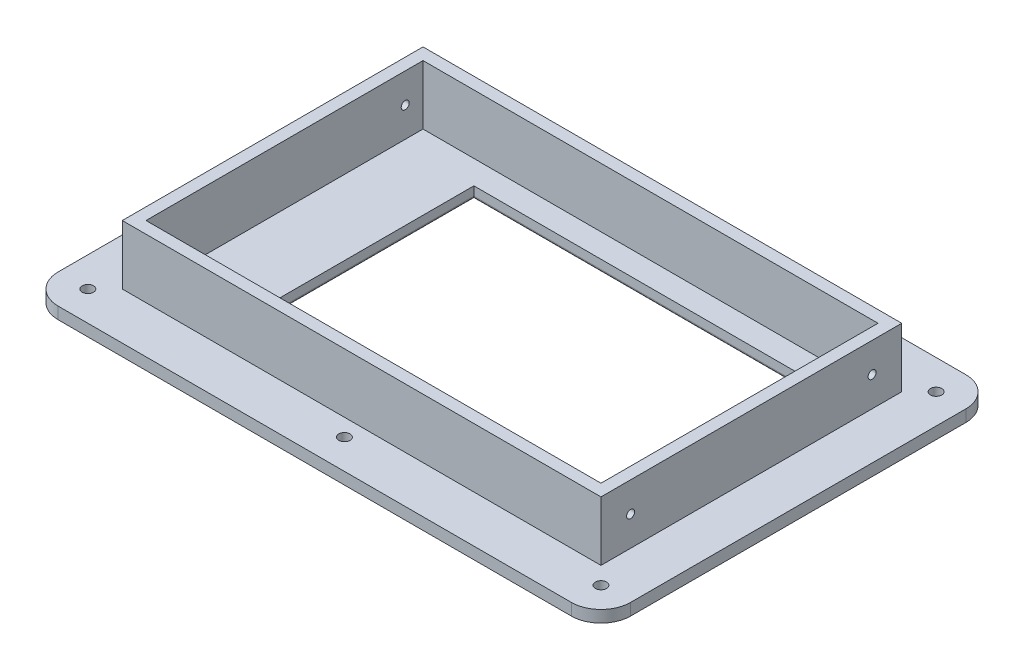
ISO-10303-21;
HEADER;
FILE_DESCRIPTION(('STEP AP214'),'2;1');
FILE_NAME('part.step','',(''),(''),'','','');
FILE_SCHEMA(('AUTOMOTIVE_DESIGN { 1 0 10303 214 1 1 1 1 }'));
ENDSEC;
DATA;
#1=APPLICATION_CONTEXT('core data for automotive mechanical design processes');
#2=APPLICATION_PROTOCOL_DEFINITION('international standard','automotive_design',2000,#1);
#3=PRODUCT_CONTEXT('',#1,'mechanical');
#4=PRODUCT('Part','Part','',(#3));
#5=PRODUCT_RELATED_PRODUCT_CATEGORY('part','',(#4));
#6=PRODUCT_DEFINITION_FORMATION('','',#4);
#7=PRODUCT_DEFINITION_CONTEXT('part definition',#1,'design');
#8=PRODUCT_DEFINITION('design','',#6,#7);
#9=PRODUCT_DEFINITION_SHAPE('','',#8);
#10=(LENGTH_UNIT() NAMED_UNIT(*) SI_UNIT(.MILLI.,.METRE.));
#11=(NAMED_UNIT(*) PLANE_ANGLE_UNIT() SI_UNIT($,.RADIAN.));
#12=(NAMED_UNIT(*) SI_UNIT($,.STERADIAN.) SOLID_ANGLE_UNIT());
#13=UNCERTAINTY_MEASURE_WITH_UNIT(LENGTH_MEASURE(1.E-05),#10,'distance_accuracy_value','');
#14=(GEOMETRIC_REPRESENTATION_CONTEXT(3) GLOBAL_UNCERTAINTY_ASSIGNED_CONTEXT((#13)) GLOBAL_UNIT_ASSIGNED_CONTEXT((#10,
#11,#12)) REPRESENTATION_CONTEXT('',''));
#15=CARTESIAN_POINT('',(0.,0.,0.));
#16=DIRECTION('',(0.,0.,1.));
#17=DIRECTION('',(1.,0.,0.));
#18=AXIS2_PLACEMENT_3D('',#15,#16,#17);
#19=CARTESIAN_POINT('',(0.,4.,0.));
#20=DIRECTION('',(0.,-1.,0.));
#21=DIRECTION('',(0.,0.,-1.));
#22=AXIS2_PLACEMENT_3D('',#19,#20,#21);
#23=PLANE('',#22);
#24=CARTESIAN_POINT('',(-86.5,4.,56.5));
#25=DIRECTION('',(0.,-1.,0.));
#26=DIRECTION('',(0.,0.,-1.));
#27=AXIS2_PLACEMENT_3D('',#24,#25,#26);
#28=CIRCLE('',#27,1.89864999999999);
#29=CARTESIAN_POINT('',(-86.5,4.,54.60135));
#30=VERTEX_POINT('',#29);
#31=EDGE_CURVE('E527',#30,#30,#28,.T.);
#32=ORIENTED_EDGE('',*,*,#31,.T.);
#33=EDGE_LOOP('',(#32));
#34=FACE_BOUND('',#33,.T.);
#35=CARTESIAN_POINT('',(-86.5,4.,-56.5));
#36=DIRECTION('',(0.,-1.,0.));
#37=DIRECTION('',(0.,0.,-1.));
#38=AXIS2_PLACEMENT_3D('',#35,#36,#37);
#39=CIRCLE('',#38,1.89864999999999);
#40=CARTESIAN_POINT('',(-86.5,4.,-58.39865));
#41=VERTEX_POINT('',#40);
#42=EDGE_CURVE('E538',#41,#41,#39,.T.);
#43=ORIENTED_EDGE('',*,*,#42,.T.);
#44=EDGE_LOOP('',(#43));
#45=FACE_BOUND('',#44,.T.);
#46=CARTESIAN_POINT('',(86.5,4.,-56.5));
#47=DIRECTION('',(0.,-1.,0.));
#48=DIRECTION('',(0.,0.,-1.));
#49=AXIS2_PLACEMENT_3D('',#46,#47,#48);
#50=CIRCLE('',#49,1.89864999999999);
#51=CARTESIAN_POINT('',(86.5,4.,-58.39865));
#52=VERTEX_POINT('',#51);
#53=EDGE_CURVE('E544',#52,#52,#50,.T.);
#54=ORIENTED_EDGE('',*,*,#53,.T.);
#55=EDGE_LOOP('',(#54));
#56=FACE_BOUND('',#55,.T.);
#57=CARTESIAN_POINT('',(86.5,4.,56.5));
#58=DIRECTION('',(0.,-1.,0.));
#59=DIRECTION('',(0.,0.,-1.));
#60=AXIS2_PLACEMENT_3D('',#57,#58,#59);
#61=CIRCLE('',#60,1.89864999999999);
#62=CARTESIAN_POINT('',(86.5,4.,54.60135));
#63=VERTEX_POINT('',#62);
#64=EDGE_CURVE('E550',#63,#63,#61,.T.);
#65=ORIENTED_EDGE('',*,*,#64,.T.);
#66=EDGE_LOOP('',(#65));
#67=FACE_BOUND('',#66,.T.);
#68=CARTESIAN_POINT('',(0.,4.,56.5));
#69=DIRECTION('',(0.,-1.,0.));
#70=DIRECTION('',(0.,0.,-1.));
#71=AXIS2_PLACEMENT_3D('',#68,#69,#70);
#72=CIRCLE('',#71,1.89864999999999);
#73=CARTESIAN_POINT('',(0.,4.,54.60135));
#74=VERTEX_POINT('',#73);
#75=EDGE_CURVE('E556',#74,#74,#72,.T.);
#76=ORIENTED_EDGE('',*,*,#75,.T.);
#77=EDGE_LOOP('',(#76));
#78=FACE_BOUND('',#77,.T.);
#79=CARTESIAN_POINT('',(0.,4.,-56.5));
#80=DIRECTION('',(0.,-1.,0.));
#81=DIRECTION('',(0.,0.,-1.));
#82=AXIS2_PLACEMENT_3D('',#79,#80,#81);
#83=CIRCLE('',#82,1.89864999999999);
#84=CARTESIAN_POINT('',(0.,4.,-58.39865));
#85=VERTEX_POINT('',#84);
#86=EDGE_CURVE('E260',#85,#85,#83,.T.);
#87=ORIENTED_EDGE('',*,*,#86,.T.);
#88=EDGE_LOOP('',(#87));
#89=FACE_BOUND('',#88,.T.);
#90=DIRECTION('',(1.,0.,0.));
#91=VECTOR('',#90,1.);
#92=CARTESIAN_POINT('',(-96.5,4.,66.5));
#93=LINE('',#92,#91);
#94=CARTESIAN_POINT('',(-86.5,4.,66.5));
#95=VERTEX_POINT('',#94);
#96=CARTESIAN_POINT('',(86.5,4.,66.5));
#97=VERTEX_POINT('',#96);
#98=EDGE_CURVE('E220',#95,#97,#93,.T.);
#99=ORIENTED_EDGE('',*,*,#98,.T.);
#100=CARTESIAN_POINT('',(86.5,4.,56.5));
#101=DIRECTION('',(0.,-1.,0.));
#102=DIRECTION('',(0.,0.,-1.));
#103=AXIS2_PLACEMENT_3D('',#100,#101,#102);
#104=CIRCLE('',#103,10.);
#105=CARTESIAN_POINT('',(96.5,4.,56.5));
#106=VERTEX_POINT('',#105);
#107=EDGE_CURVE('E289',#97,#106,#104,.F.);
#108=ORIENTED_EDGE('',*,*,#107,.T.);
#109=DIRECTION('',(0.,0.,-1.));
#110=VECTOR('',#109,1.);
#111=CARTESIAN_POINT('',(96.5,4.,66.5));
#112=LINE('',#111,#110);
#113=CARTESIAN_POINT('',(96.5,4.,-56.5));
#114=VERTEX_POINT('',#113);
#115=EDGE_CURVE('E322',#106,#114,#112,.T.);
#116=ORIENTED_EDGE('',*,*,#115,.T.);
#117=CARTESIAN_POINT('',(86.5,4.,-56.5));
#118=DIRECTION('',(0.,-1.,0.));
#119=DIRECTION('',(0.,0.,-1.));
#120=AXIS2_PLACEMENT_3D('',#117,#118,#119);
#121=CIRCLE('',#120,10.);
#122=CARTESIAN_POINT('',(86.5,4.,-66.5));
#123=VERTEX_POINT('',#122);
#124=EDGE_CURVE('E284',#114,#123,#121,.F.);
#125=ORIENTED_EDGE('',*,*,#124,.T.);
#126=DIRECTION('',(-1.,0.,0.));
#127=VECTOR('',#126,1.);
#128=CARTESIAN_POINT('',(-96.5,4.,-66.5));
#129=LINE('',#128,#127);
#130=CARTESIAN_POINT('',(-86.5,4.,-66.5));
#131=VERTEX_POINT('',#130);
#132=EDGE_CURVE('E304',#123,#131,#129,.T.);
#133=ORIENTED_EDGE('',*,*,#132,.T.);
#134=CARTESIAN_POINT('',(-86.5,4.,-56.5));
#135=DIRECTION('',(0.,-1.,0.));
#136=DIRECTION('',(0.,0.,-1.));
#137=AXIS2_PLACEMENT_3D('',#134,#135,#136);
#138=CIRCLE('',#137,10.);
#139=CARTESIAN_POINT('',(-96.5,4.,-56.5));
#140=VERTEX_POINT('',#139);
#141=EDGE_CURVE('E80',#131,#140,#138,.F.);
#142=ORIENTED_EDGE('',*,*,#141,.T.);
#143=DIRECTION('',(0.,0.,1.));
#144=VECTOR('',#143,1.);
#145=CARTESIAN_POINT('',(-96.5,4.,66.5));
#146=LINE('',#145,#144);
#147=CARTESIAN_POINT('',(-96.5,4.,56.5));
#148=VERTEX_POINT('',#147);
#149=EDGE_CURVE('E403',#140,#148,#146,.T.);
#150=ORIENTED_EDGE('',*,*,#149,.T.);
#151=CARTESIAN_POINT('',(-86.5,4.,56.5));
#152=DIRECTION('',(0.,-1.,0.));
#153=DIRECTION('',(0.,0.,-1.));
#154=AXIS2_PLACEMENT_3D('',#151,#152,#153);
#155=CIRCLE('',#154,10.);
#156=EDGE_CURVE('E287',#148,#95,#155,.F.);
#157=ORIENTED_EDGE('',*,*,#156,.T.);
#158=EDGE_LOOP('',(#99,#108,#116,#125,#133,#142,#150,#157));
#159=FACE_BOUND('',#158,.T.);
#160=DIRECTION('',(0.,0.,-1.));
#161=VECTOR('',#160,1.);
#162=CARTESIAN_POINT('',(80.7,4.,0.));
#163=LINE('',#162,#161);
#164=CARTESIAN_POINT('',(80.7,4.,50.7));
#165=VERTEX_POINT('',#164);
#166=CARTESIAN_POINT('',(80.7,4.,-50.7));
#167=VERTEX_POINT('',#166);
#168=EDGE_CURVE('E368',#165,#167,#163,.T.);
#169=ORIENTED_EDGE('',*,*,#168,.F.);
#170=DIRECTION('',(1.,0.,0.));
#171=VECTOR('',#170,1.);
#172=CARTESIAN_POINT('',(0.,4.,50.7));
#173=LINE('',#172,#171);
#174=CARTESIAN_POINT('',(-80.7,4.,50.7));
#175=VERTEX_POINT('',#174);
#176=EDGE_CURVE('E373',#175,#165,#173,.T.);
#177=ORIENTED_EDGE('',*,*,#176,.F.);
#178=DIRECTION('',(0.,0.,1.));
#179=VECTOR('',#178,1.);
#180=CARTESIAN_POINT('',(-80.7,4.,0.));
#181=LINE('',#180,#179);
#182=CARTESIAN_POINT('',(-80.7,4.,-50.7));
#183=VERTEX_POINT('',#182);
#184=EDGE_CURVE('E385',#183,#175,#181,.T.);
#185=ORIENTED_EDGE('',*,*,#184,.F.);
#186=DIRECTION('',(-1.,0.,0.));
#187=VECTOR('',#186,1.);
#188=CARTESIAN_POINT('',(0.,4.,-50.7));
#189=LINE('',#188,#187);
#190=EDGE_CURVE('E382',#167,#183,#189,.T.);
#191=ORIENTED_EDGE('',*,*,#190,.F.);
#192=EDGE_LOOP('',(#169,#177,#185,#191));
#193=FACE_BOUND('',#192,.T.);
#194=ADVANCED_FACE('F57',(#34,#45,#56,#67,#78,#89,#159,#193),#23,.F.);
#195=CARTESIAN_POINT('',(96.5,4.,66.5));
#196=DIRECTION('',(-1.,0.,0.));
#197=DIRECTION('',(0.,0.,1.));
#198=AXIS2_PLACEMENT_3D('',#195,#196,#197);
#199=PLANE('',#198);
#200=ORIENTED_EDGE('',*,*,#115,.F.);
#201=DIRECTION('',(0.,-1.,0.));
#202=VECTOR('',#201,1.);
#203=CARTESIAN_POINT('',(96.5,4.,56.5));
#204=LINE('',#203,#202);
#205=CARTESIAN_POINT('',(96.5,0.,56.5));
#206=VERTEX_POINT('',#205);
#207=EDGE_CURVE('E268',#106,#206,#204,.T.);
#208=ORIENTED_EDGE('',*,*,#207,.T.);
#209=DIRECTION('',(0.,0.,-1.));
#210=VECTOR('',#209,1.);
#211=CARTESIAN_POINT('',(96.5,0.,66.5));
#212=LINE('',#211,#210);
#213=CARTESIAN_POINT('',(96.5,0.,-56.5));
#214=VERTEX_POINT('',#213);
#215=EDGE_CURVE('E313',#206,#214,#212,.T.);
#216=ORIENTED_EDGE('',*,*,#215,.T.);
#217=DIRECTION('',(0.,-1.,0.));
#218=VECTOR('',#217,1.);
#219=CARTESIAN_POINT('',(96.5,4.,-56.5));
#220=LINE('',#219,#218);
#221=EDGE_CURVE('E256',#214,#114,#220,.F.);
#222=ORIENTED_EDGE('',*,*,#221,.T.);
#223=EDGE_LOOP('',(#200,#208,#216,#222));
#224=FACE_BOUND('',#223,.T.);
#225=ADVANCED_FACE('F417',(#224),#199,.F.);
#226=CARTESIAN_POINT('',(-96.5,4.,-66.5));
#227=DIRECTION('',(0.,0.,1.));
#228=DIRECTION('',(1.,0.,0.));
#229=AXIS2_PLACEMENT_3D('',#226,#227,#228);
#230=PLANE('',#229);
#231=DIRECTION('',(-1.,0.,0.));
#232=VECTOR('',#231,1.);
#233=CARTESIAN_POINT('',(-96.5,0.,-66.5));
#234=LINE('',#233,#232);
#235=CARTESIAN_POINT('',(86.5,0.,-66.5));
#236=VERTEX_POINT('',#235);
#237=CARTESIAN_POINT('',(-86.5,0.,-66.5));
#238=VERTEX_POINT('',#237);
#239=EDGE_CURVE('E302',#236,#238,#234,.T.);
#240=ORIENTED_EDGE('',*,*,#239,.T.);
#241=DIRECTION('',(0.,-1.,0.));
#242=VECTOR('',#241,1.);
#243=CARTESIAN_POINT('',(-86.5,4.,-66.5));
#244=LINE('',#243,#242);
#245=EDGE_CURVE('E12',#238,#131,#244,.F.);
#246=ORIENTED_EDGE('',*,*,#245,.T.);
#247=ORIENTED_EDGE('',*,*,#132,.F.);
#248=DIRECTION('',(0.,-1.,0.));
#249=VECTOR('',#248,1.);
#250=CARTESIAN_POINT('',(86.5,4.,-66.5));
#251=LINE('',#250,#249);
#252=EDGE_CURVE('E66',#123,#236,#251,.T.);
#253=ORIENTED_EDGE('',*,*,#252,.T.);
#254=EDGE_LOOP('',(#240,#246,#247,#253));
#255=FACE_BOUND('',#254,.T.);
#256=ADVANCED_FACE('F301',(#255),#230,.F.);
#257=CARTESIAN_POINT('',(-96.5,4.,66.5));
#258=DIRECTION('',(1.,0.,0.));
#259=DIRECTION('',(0.,0.,-1.));
#260=AXIS2_PLACEMENT_3D('',#257,#258,#259);
#261=PLANE('',#260);
#262=DIRECTION('',(0.,0.,1.));
#263=VECTOR('',#262,1.);
#264=CARTESIAN_POINT('',(-96.5,0.,66.5));
#265=LINE('',#264,#263);
#266=CARTESIAN_POINT('',(-96.5,0.,-56.5));
#267=VERTEX_POINT('',#266);
#268=CARTESIAN_POINT('',(-96.5,0.,56.5));
#269=VERTEX_POINT('',#268);
#270=EDGE_CURVE('E312',#267,#269,#265,.T.);
#271=ORIENTED_EDGE('',*,*,#270,.T.);
#272=DIRECTION('',(0.,-1.,0.));
#273=VECTOR('',#272,1.);
#274=CARTESIAN_POINT('',(-96.5,4.,56.5));
#275=LINE('',#274,#273);
#276=EDGE_CURVE('E73',#269,#148,#275,.F.);
#277=ORIENTED_EDGE('',*,*,#276,.T.);
#278=ORIENTED_EDGE('',*,*,#149,.F.);
#279=DIRECTION('',(0.,-1.,0.));
#280=VECTOR('',#279,1.);
#281=CARTESIAN_POINT('',(-96.5,4.,-56.5));
#282=LINE('',#281,#280);
#283=EDGE_CURVE('E291',#140,#267,#282,.T.);
#284=ORIENTED_EDGE('',*,*,#283,.T.);
#285=EDGE_LOOP('',(#271,#277,#278,#284));
#286=FACE_BOUND('',#285,.T.);
#287=ADVANCED_FACE('F423',(#286),#261,.F.);
#288=CARTESIAN_POINT('',(-96.5,4.,66.5));
#289=DIRECTION('',(0.,0.,-1.));
#290=DIRECTION('',(-1.,0.,0.));
#291=AXIS2_PLACEMENT_3D('',#288,#289,#290);
#292=PLANE('',#291);
#293=DIRECTION('',(1.,0.,0.));
#294=VECTOR('',#293,1.);
#295=CARTESIAN_POINT('',(-96.5,0.,66.5));
#296=LINE('',#295,#294);
#297=CARTESIAN_POINT('',(-86.5,0.,66.5));
#298=VERTEX_POINT('',#297);
#299=CARTESIAN_POINT('',(86.5,0.,66.5));
#300=VERTEX_POINT('',#299);
#301=EDGE_CURVE('E315',#298,#300,#296,.T.);
#302=ORIENTED_EDGE('',*,*,#301,.T.);
#303=DIRECTION('',(0.,-1.,0.));
#304=VECTOR('',#303,1.);
#305=CARTESIAN_POINT('',(86.5,4.,66.5));
#306=LINE('',#305,#304);
#307=EDGE_CURVE('E282',#300,#97,#306,.F.);
#308=ORIENTED_EDGE('',*,*,#307,.T.);
#309=ORIENTED_EDGE('',*,*,#98,.F.);
#310=DIRECTION('',(0.,-1.,0.));
#311=VECTOR('',#310,1.);
#312=CARTESIAN_POINT('',(-86.5,4.,66.5));
#313=LINE('',#312,#311);
#314=EDGE_CURVE('E279',#95,#298,#313,.T.);
#315=ORIENTED_EDGE('',*,*,#314,.T.);
#316=EDGE_LOOP('',(#302,#308,#309,#315));
#317=FACE_BOUND('',#316,.T.);
#318=ADVANCED_FACE('F420',(#317),#292,.F.);
#319=CARTESIAN_POINT('',(0.,0.,0.));
#320=DIRECTION('',(0.,-1.,0.));
#321=DIRECTION('',(0.,0.,-1.));
#322=AXIS2_PLACEMENT_3D('',#319,#320,#321);
#323=PLANE('',#322);
#324=CARTESIAN_POINT('',(-86.5,0.,56.5));
#325=DIRECTION('',(0.,-1.,0.));
#326=DIRECTION('',(0.,0.,-1.));
#327=AXIS2_PLACEMENT_3D('',#324,#325,#326);
#328=CIRCLE('',#327,1.89864999999999);
#329=CARTESIAN_POINT('',(-86.5,0.,54.60135));
#330=VERTEX_POINT('',#329);
#331=EDGE_CURVE('E523',#330,#330,#328,.T.);
#332=ORIENTED_EDGE('',*,*,#331,.F.);
#333=EDGE_LOOP('',(#332));
#334=FACE_BOUND('',#333,.T.);
#335=CARTESIAN_POINT('',(-86.5,0.,-56.5));
#336=DIRECTION('',(0.,-1.,0.));
#337=DIRECTION('',(0.,0.,-1.));
#338=AXIS2_PLACEMENT_3D('',#335,#336,#337);
#339=CIRCLE('',#338,1.89864999999999);
#340=CARTESIAN_POINT('',(-86.5,0.,-58.39865));
#341=VERTEX_POINT('',#340);
#342=EDGE_CURVE('E535',#341,#341,#339,.T.);
#343=ORIENTED_EDGE('',*,*,#342,.F.);
#344=EDGE_LOOP('',(#343));
#345=FACE_BOUND('',#344,.T.);
#346=CARTESIAN_POINT('',(86.5,0.,-56.5));
#347=DIRECTION('',(0.,-1.,0.));
#348=DIRECTION('',(0.,0.,-1.));
#349=AXIS2_PLACEMENT_3D('',#346,#347,#348);
#350=CIRCLE('',#349,1.89864999999999);
#351=CARTESIAN_POINT('',(86.5,0.,-58.39865));
#352=VERTEX_POINT('',#351);
#353=EDGE_CURVE('E541',#352,#352,#350,.T.);
#354=ORIENTED_EDGE('',*,*,#353,.F.);
#355=EDGE_LOOP('',(#354));
#356=FACE_BOUND('',#355,.T.);
#357=CARTESIAN_POINT('',(86.5,0.,56.5));
#358=DIRECTION('',(0.,-1.,0.));
#359=DIRECTION('',(0.,0.,-1.));
#360=AXIS2_PLACEMENT_3D('',#357,#358,#359);
#361=CIRCLE('',#360,1.89864999999999);
#362=CARTESIAN_POINT('',(86.5,0.,54.60135));
#363=VERTEX_POINT('',#362);
#364=EDGE_CURVE('E547',#363,#363,#361,.T.);
#365=ORIENTED_EDGE('',*,*,#364,.F.);
#366=EDGE_LOOP('',(#365));
#367=FACE_BOUND('',#366,.T.);
#368=CARTESIAN_POINT('',(0.,0.,56.5));
#369=DIRECTION('',(0.,-1.,0.));
#370=DIRECTION('',(0.,0.,-1.));
#371=AXIS2_PLACEMENT_3D('',#368,#369,#370);
#372=CIRCLE('',#371,1.89864999999999);
#373=CARTESIAN_POINT('',(0.,0.,54.60135));
#374=VERTEX_POINT('',#373);
#375=EDGE_CURVE('E553',#374,#374,#372,.T.);
#376=ORIENTED_EDGE('',*,*,#375,.F.);
#377=EDGE_LOOP('',(#376));
#378=FACE_BOUND('',#377,.T.);
#379=CARTESIAN_POINT('',(0.,0.,-56.5));
#380=DIRECTION('',(0.,-1.,0.));
#381=DIRECTION('',(0.,0.,-1.));
#382=AXIS2_PLACEMENT_3D('',#379,#380,#381);
#383=CIRCLE('',#382,1.89864999999999);
#384=CARTESIAN_POINT('',(0.,0.,-58.39865));
#385=VERTEX_POINT('',#384);
#386=EDGE_CURVE('E559',#385,#385,#383,.T.);
#387=ORIENTED_EDGE('',*,*,#386,.F.);
#388=EDGE_LOOP('',(#387));
#389=FACE_BOUND('',#388,.T.);
#390=DIRECTION('',(0.,0.,1.));
#391=VECTOR('',#390,1.);
#392=CARTESIAN_POINT('',(61.45,0.,-38.7));
#393=LINE('',#392,#391);
#394=CARTESIAN_POINT('',(61.45,0.,33.2));
#395=VERTEX_POINT('',#394);
#396=CARTESIAN_POINT('',(61.45,0.,-39.7));
#397=VERTEX_POINT('',#396);
#398=EDGE_CURVE('E246',#395,#397,#393,.F.);
#399=ORIENTED_EDGE('',*,*,#398,.T.);
#400=DIRECTION('',(1.,0.,0.));
#401=VECTOR('',#400,1.);
#402=CARTESIAN_POINT('',(-51.55,0.,-39.7));
#403=LINE('',#402,#401);
#404=CARTESIAN_POINT('',(-52.55,0.,-39.7));
#405=VERTEX_POINT('',#404);
#406=EDGE_CURVE('E248',#397,#405,#403,.F.);
#407=ORIENTED_EDGE('',*,*,#406,.T.);
#408=DIRECTION('',(0.,0.,-1.));
#409=VECTOR('',#408,1.);
#410=CARTESIAN_POINT('',(-52.55,0.,32.2));
#411=LINE('',#410,#409);
#412=CARTESIAN_POINT('',(-52.55,0.,33.2));
#413=VERTEX_POINT('',#412);
#414=EDGE_CURVE('E244',#405,#413,#411,.F.);
#415=ORIENTED_EDGE('',*,*,#414,.T.);
#416=DIRECTION('',(-1.,0.,0.));
#417=VECTOR('',#416,1.);
#418=CARTESIAN_POINT('',(60.45,0.,33.2));
#419=LINE('',#418,#417);
#420=EDGE_CURVE('E238',#413,#395,#419,.F.);
#421=ORIENTED_EDGE('',*,*,#420,.T.);
#422=EDGE_LOOP('',(#399,#407,#415,#421));
#423=FACE_BOUND('',#422,.T.);
#424=ORIENTED_EDGE('',*,*,#215,.F.);
#425=CARTESIAN_POINT('',(86.5,0.,56.5));
#426=DIRECTION('',(0.,-1.,0.));
#427=DIRECTION('',(0.,0.,-1.));
#428=AXIS2_PLACEMENT_3D('',#425,#426,#427);
#429=CIRCLE('',#428,10.);
#430=EDGE_CURVE('E277',#206,#300,#429,.T.);
#431=ORIENTED_EDGE('',*,*,#430,.T.);
#432=ORIENTED_EDGE('',*,*,#301,.F.);
#433=CARTESIAN_POINT('',(-86.5,0.,56.5));
#434=DIRECTION('',(0.,-1.,0.));
#435=DIRECTION('',(0.,0.,-1.));
#436=AXIS2_PLACEMENT_3D('',#433,#434,#435);
#437=CIRCLE('',#436,10.);
#438=EDGE_CURVE('E275',#298,#269,#437,.T.);
#439=ORIENTED_EDGE('',*,*,#438,.T.);
#440=ORIENTED_EDGE('',*,*,#270,.F.);
#441=CARTESIAN_POINT('',(-86.5,0.,-56.5));
#442=DIRECTION('',(0.,-1.,0.));
#443=DIRECTION('',(0.,0.,-1.));
#444=AXIS2_PLACEMENT_3D('',#441,#442,#443);
#445=CIRCLE('',#444,10.);
#446=EDGE_CURVE('E273',#267,#238,#445,.T.);
#447=ORIENTED_EDGE('',*,*,#446,.T.);
#448=ORIENTED_EDGE('',*,*,#239,.F.);
#449=CARTESIAN_POINT('',(86.5,0.,-56.5));
#450=DIRECTION('',(0.,-1.,0.));
#451=DIRECTION('',(0.,0.,-1.));
#452=AXIS2_PLACEMENT_3D('',#449,#450,#451);
#453=CIRCLE('',#452,10.);
#454=EDGE_CURVE('E271',#236,#214,#453,.T.);
#455=ORIENTED_EDGE('',*,*,#454,.T.);
#456=EDGE_LOOP('',(#424,#431,#432,#439,#440,#447,#448,#455));
#457=FACE_BOUND('',#456,.T.);
#458=ADVANCED_FACE('F309',(#334,#345,#356,#367,#378,#389,#423,#457),#323,.T.);
#459=CARTESIAN_POINT('',(0.,24.,0.));
#460=DIRECTION('',(0.,1.,0.));
#461=DIRECTION('',(0.,0.,1.));
#462=AXIS2_PLACEMENT_3D('',#459,#460,#461);
#463=PLANE('',#462);
#464=DIRECTION('',(0.,0.,-1.));
#465=VECTOR('',#464,1.);
#466=CARTESIAN_POINT('',(80.7,24.,0.));
#467=LINE('',#466,#465);
#468=CARTESIAN_POINT('',(80.7,24.,50.7));
#469=VERTEX_POINT('',#468);
#470=CARTESIAN_POINT('',(80.7,24.,-50.7));
#471=VERTEX_POINT('',#470);
#472=EDGE_CURVE('E369',#469,#471,#467,.T.);
#473=ORIENTED_EDGE('',*,*,#472,.T.);
#474=DIRECTION('',(-1.,0.,0.));
#475=VECTOR('',#474,1.);
#476=CARTESIAN_POINT('',(0.,24.,-50.7));
#477=LINE('',#476,#475);
#478=CARTESIAN_POINT('',(-80.7,24.,-50.7));
#479=VERTEX_POINT('',#478);
#480=EDGE_CURVE('E372',#471,#479,#477,.T.);
#481=ORIENTED_EDGE('',*,*,#480,.T.);
#482=DIRECTION('',(0.,0.,1.));
#483=VECTOR('',#482,1.);
#484=CARTESIAN_POINT('',(-80.7,24.,0.));
#485=LINE('',#484,#483);
#486=CARTESIAN_POINT('',(-80.7,24.,50.7));
#487=VERTEX_POINT('',#486);
#488=EDGE_CURVE('E375',#479,#487,#485,.T.);
#489=ORIENTED_EDGE('',*,*,#488,.T.);
#490=DIRECTION('',(1.,0.,0.));
#491=VECTOR('',#490,1.);
#492=CARTESIAN_POINT('',(0.,24.,50.7));
#493=LINE('',#492,#491);
#494=EDGE_CURVE('E377',#487,#469,#493,.T.);
#495=ORIENTED_EDGE('',*,*,#494,.T.);
#496=EDGE_LOOP('',(#473,#481,#489,#495));
#497=FACE_BOUND('',#496,.T.);
#498=DIRECTION('',(-1.,0.,0.));
#499=VECTOR('',#498,1.);
#500=CARTESIAN_POINT('',(-76.7,24.,-46.7));
#501=LINE('',#500,#499);
#502=CARTESIAN_POINT('',(76.7,24.,-46.7));
#503=VERTEX_POINT('',#502);
#504=CARTESIAN_POINT('',(-76.7,24.,-46.7));
#505=VERTEX_POINT('',#504);
#506=EDGE_CURVE('E341',#503,#505,#501,.T.);
#507=ORIENTED_EDGE('',*,*,#506,.F.);
#508=DIRECTION('',(0.,0.,-1.));
#509=VECTOR('',#508,1.);
#510=CARTESIAN_POINT('',(76.7,24.,46.7));
#511=LINE('',#510,#509);
#512=CARTESIAN_POINT('',(76.7,24.,46.7));
#513=VERTEX_POINT('',#512);
#514=EDGE_CURVE('E339',#513,#503,#511,.T.);
#515=ORIENTED_EDGE('',*,*,#514,.F.);
#516=DIRECTION('',(1.,0.,0.));
#517=VECTOR('',#516,1.);
#518=CARTESIAN_POINT('',(-76.7,24.,46.7));
#519=LINE('',#518,#517);
#520=CARTESIAN_POINT('',(-76.7,24.,46.7));
#521=VERTEX_POINT('',#520);
#522=EDGE_CURVE('E347',#521,#513,#519,.T.);
#523=ORIENTED_EDGE('',*,*,#522,.F.);
#524=DIRECTION('',(0.,0.,1.));
#525=VECTOR('',#524,1.);
#526=CARTESIAN_POINT('',(-76.7,24.,46.7));
#527=LINE('',#526,#525);
#528=EDGE_CURVE('E344',#505,#521,#527,.T.);
#529=ORIENTED_EDGE('',*,*,#528,.F.);
#530=EDGE_LOOP('',(#507,#515,#523,#529));
#531=FACE_BOUND('',#530,.T.);
#532=ADVANCED_FACE('F475',(#497,#531),#463,.T.);
#533=CARTESIAN_POINT('',(80.7,24.,0.));
#534=DIRECTION('',(-1.,0.,0.));
#535=DIRECTION('',(0.,0.,1.));
#536=AXIS2_PLACEMENT_3D('',#533,#534,#535);
#537=PLANE('',#536);
#538=CARTESIAN_POINT('',(80.7,14.,-40.7));
#539=DIRECTION('',(-1.,0.,0.));
#540=DIRECTION('',(0.,0.,1.));
#541=AXIS2_PLACEMENT_3D('',#538,#539,#540);
#542=CIRCLE('',#541,1.35254999999997);
#543=CARTESIAN_POINT('',(80.7,14.,-39.34745));
#544=VERTEX_POINT('',#543);
#545=EDGE_CURVE('E497',#544,#544,#542,.T.);
#546=ORIENTED_EDGE('',*,*,#545,.T.);
#547=EDGE_LOOP('',(#546));
#548=FACE_BOUND('',#547,.T.);
#549=CARTESIAN_POINT('',(80.7,14.,40.7));
#550=DIRECTION('',(-1.,0.,0.));
#551=DIRECTION('',(0.,0.,1.));
#552=AXIS2_PLACEMENT_3D('',#549,#550,#551);
#553=CIRCLE('',#552,1.35254999999997);
#554=CARTESIAN_POINT('',(80.7,14.,42.05255));
#555=VERTEX_POINT('',#554);
#556=EDGE_CURVE('E501',#555,#555,#553,.T.);
#557=ORIENTED_EDGE('',*,*,#556,.T.);
#558=EDGE_LOOP('',(#557));
#559=FACE_BOUND('',#558,.T.);
#560=ORIENTED_EDGE('',*,*,#168,.T.);
#561=DIRECTION('',(0.,-1.,0.));
#562=VECTOR('',#561,1.);
#563=CARTESIAN_POINT('',(80.7,24.,-50.7));
#564=LINE('',#563,#562);
#565=EDGE_CURVE('E317',#471,#167,#564,.T.);
#566=ORIENTED_EDGE('',*,*,#565,.F.);
#567=ORIENTED_EDGE('',*,*,#472,.F.);
#568=DIRECTION('',(0.,-1.,0.));
#569=VECTOR('',#568,1.);
#570=CARTESIAN_POINT('',(80.7,24.,50.7));
#571=LINE('',#570,#569);
#572=EDGE_CURVE('E379',#469,#165,#571,.T.);
#573=ORIENTED_EDGE('',*,*,#572,.T.);
#574=EDGE_LOOP('',(#560,#566,#567,#573));
#575=FACE_BOUND('',#574,.T.);
#576=ADVANCED_FACE('F478',(#548,#559,#575),#537,.F.);
#577=CARTESIAN_POINT('',(0.,24.,-50.7));
#578=DIRECTION('',(0.,0.,1.));
#579=DIRECTION('',(1.,0.,0.));
#580=AXIS2_PLACEMENT_3D('',#577,#578,#579);
#581=PLANE('',#580);
#582=ORIENTED_EDGE('',*,*,#190,.T.);
#583=DIRECTION('',(0.,-1.,0.));
#584=VECTOR('',#583,1.);
#585=CARTESIAN_POINT('',(-80.7,24.,-50.7));
#586=LINE('',#585,#584);
#587=EDGE_CURVE('E395',#479,#183,#586,.T.);
#588=ORIENTED_EDGE('',*,*,#587,.F.);
#589=ORIENTED_EDGE('',*,*,#480,.F.);
#590=ORIENTED_EDGE('',*,*,#565,.T.);
#591=EDGE_LOOP('',(#582,#588,#589,#590));
#592=FACE_BOUND('',#591,.T.);
#593=ADVANCED_FACE('F486',(#592),#581,.F.);
#594=CARTESIAN_POINT('',(-80.7,24.,0.));
#595=DIRECTION('',(1.,0.,0.));
#596=DIRECTION('',(0.,0.,-1.));
#597=AXIS2_PLACEMENT_3D('',#594,#595,#596);
#598=PLANE('',#597);
#599=CARTESIAN_POINT('',(-80.7,14.,-40.7));
#600=DIRECTION('',(-1.,0.,0.));
#601=DIRECTION('',(0.,0.,1.));
#602=AXIS2_PLACEMENT_3D('',#599,#600,#601);
#603=CIRCLE('',#602,1.35254999999998);
#604=CARTESIAN_POINT('',(-80.7,14.,-39.34745));
#605=VERTEX_POINT('',#604);
#606=EDGE_CURVE('E897',#605,#605,#603,.T.);
#607=ORIENTED_EDGE('',*,*,#606,.F.);
#608=EDGE_LOOP('',(#607));
#609=FACE_BOUND('',#608,.T.);
#610=CARTESIAN_POINT('',(-80.7,14.,40.7));
#611=DIRECTION('',(-1.,0.,0.));
#612=DIRECTION('',(0.,0.,1.));
#613=AXIS2_PLACEMENT_3D('',#610,#611,#612);
#614=CIRCLE('',#613,1.35254999999998);
#615=CARTESIAN_POINT('',(-80.7,14.,42.05255));
#616=VERTEX_POINT('',#615);
#617=EDGE_CURVE('E885',#616,#616,#614,.T.);
#618=ORIENTED_EDGE('',*,*,#617,.F.);
#619=EDGE_LOOP('',(#618));
#620=FACE_BOUND('',#619,.T.);
#621=ORIENTED_EDGE('',*,*,#184,.T.);
#622=DIRECTION('',(0.,-1.,0.));
#623=VECTOR('',#622,1.);
#624=CARTESIAN_POINT('',(-80.7,24.,50.7));
#625=LINE('',#624,#623);
#626=EDGE_CURVE('E392',#487,#175,#625,.T.);
#627=ORIENTED_EDGE('',*,*,#626,.F.);
#628=ORIENTED_EDGE('',*,*,#488,.F.);
#629=ORIENTED_EDGE('',*,*,#587,.T.);
#630=EDGE_LOOP('',(#621,#627,#628,#629));
#631=FACE_BOUND('',#630,.T.);
#632=ADVANCED_FACE('F482',(#609,#620,#631),#598,.F.);
#633=CARTESIAN_POINT('',(0.,24.,50.7));
#634=DIRECTION('',(0.,0.,-1.));
#635=DIRECTION('',(-1.,0.,0.));
#636=AXIS2_PLACEMENT_3D('',#633,#634,#635);
#637=PLANE('',#636);
#638=ORIENTED_EDGE('',*,*,#176,.T.);
#639=ORIENTED_EDGE('',*,*,#572,.F.);
#640=ORIENTED_EDGE('',*,*,#494,.F.);
#641=ORIENTED_EDGE('',*,*,#626,.T.);
#642=EDGE_LOOP('',(#638,#639,#640,#641));
#643=FACE_BOUND('',#642,.T.);
#644=ADVANCED_FACE('F473',(#643),#637,.F.);
#645=CARTESIAN_POINT('',(76.7,24.,46.7));
#646=DIRECTION('',(-1.,0.,0.));
#647=DIRECTION('',(0.,0.,1.));
#648=AXIS2_PLACEMENT_3D('',#645,#646,#647);
#649=PLANE('',#648);
#650=CARTESIAN_POINT('',(76.7,14.,-40.7));
#651=DIRECTION('',(-1.,0.,0.));
#652=DIRECTION('',(0.,0.,1.));
#653=AXIS2_PLACEMENT_3D('',#650,#651,#652);
#654=CIRCLE('',#653,1.35254999999997);
#655=CARTESIAN_POINT('',(76.7,14.,-39.34745));
#656=VERTEX_POINT('',#655);
#657=EDGE_CURVE('E884',#656,#656,#654,.T.);
#658=ORIENTED_EDGE('',*,*,#657,.F.);
#659=EDGE_LOOP('',(#658));
#660=FACE_BOUND('',#659,.T.);
#661=CARTESIAN_POINT('',(76.7,14.,40.7));
#662=DIRECTION('',(-1.,0.,0.));
#663=DIRECTION('',(0.,0.,1.));
#664=AXIS2_PLACEMENT_3D('',#661,#662,#663);
#665=CIRCLE('',#664,1.35254999999997);
#666=CARTESIAN_POINT('',(76.7,14.,42.05255));
#667=VERTEX_POINT('',#666);
#668=EDGE_CURVE('E524',#667,#667,#665,.T.);
#669=ORIENTED_EDGE('',*,*,#668,.F.);
#670=EDGE_LOOP('',(#669));
#671=FACE_BOUND('',#670,.T.);
#672=DIRECTION('',(0.,0.,-1.));
#673=VECTOR('',#672,1.);
#674=CARTESIAN_POINT('',(76.7,4.,46.7));
#675=LINE('',#674,#673);
#676=CARTESIAN_POINT('',(76.7,4.,46.7));
#677=VERTEX_POINT('',#676);
#678=CARTESIAN_POINT('',(76.7,4.,-46.7));
#679=VERTEX_POINT('',#678);
#680=EDGE_CURVE('E334',#677,#679,#675,.T.);
#681=ORIENTED_EDGE('',*,*,#680,.F.);
#682=DIRECTION('',(0.,-1.,0.));
#683=VECTOR('',#682,1.);
#684=CARTESIAN_POINT('',(76.7,24.,46.7));
#685=LINE('',#684,#683);
#686=EDGE_CURVE('E349',#513,#677,#685,.T.);
#687=ORIENTED_EDGE('',*,*,#686,.F.);
#688=ORIENTED_EDGE('',*,*,#514,.T.);
#689=DIRECTION('',(0.,-1.,0.));
#690=VECTOR('',#689,1.);
#691=CARTESIAN_POINT('',(76.7,24.,-46.7));
#692=LINE('',#691,#690);
#693=EDGE_CURVE('E365',#503,#679,#692,.T.);
#694=ORIENTED_EDGE('',*,*,#693,.T.);
#695=EDGE_LOOP('',(#681,#687,#688,#694));
#696=FACE_BOUND('',#695,.T.);
#697=ADVANCED_FACE('F469',(#660,#671,#696),#649,.T.);
#698=CARTESIAN_POINT('',(-76.7,24.,-46.7));
#699=DIRECTION('',(0.,0.,1.));
#700=DIRECTION('',(1.,0.,0.));
#701=AXIS2_PLACEMENT_3D('',#698,#699,#700);
#702=PLANE('',#701);
#703=DIRECTION('',(-1.,0.,0.));
#704=VECTOR('',#703,1.);
#705=CARTESIAN_POINT('',(-76.7,4.,-46.7));
#706=LINE('',#705,#704);
#707=CARTESIAN_POINT('',(-76.7,4.,-46.7));
#708=VERTEX_POINT('',#707);
#709=EDGE_CURVE('E352',#679,#708,#706,.T.);
#710=ORIENTED_EDGE('',*,*,#709,.F.);
#711=ORIENTED_EDGE('',*,*,#693,.F.);
#712=ORIENTED_EDGE('',*,*,#506,.T.);
#713=DIRECTION('',(0.,-1.,0.));
#714=VECTOR('',#713,1.);
#715=CARTESIAN_POINT('',(-76.7,24.,-46.7));
#716=LINE('',#715,#714);
#717=EDGE_CURVE('E363',#505,#708,#716,.T.);
#718=ORIENTED_EDGE('',*,*,#717,.T.);
#719=EDGE_LOOP('',(#710,#711,#712,#718));
#720=FACE_BOUND('',#719,.T.);
#721=ADVANCED_FACE('F461',(#720),#702,.T.);
#722=CARTESIAN_POINT('',(-76.7,24.,46.7));
#723=DIRECTION('',(1.,0.,0.));
#724=DIRECTION('',(0.,0.,-1.));
#725=AXIS2_PLACEMENT_3D('',#722,#723,#724);
#726=PLANE('',#725);
#727=CARTESIAN_POINT('',(-76.7,14.,-40.7));
#728=DIRECTION('',(1.,0.,0.));
#729=DIRECTION('',(0.,0.,-1.));
#730=AXIS2_PLACEMENT_3D('',#727,#728,#729);
#731=CIRCLE('',#730,1.35254999999997);
#732=CARTESIAN_POINT('',(-76.7,14.,-42.05255));
#733=VERTEX_POINT('',#732);
#734=EDGE_CURVE('E61',#733,#733,#731,.T.);
#735=ORIENTED_EDGE('',*,*,#734,.F.);
#736=EDGE_LOOP('',(#735));
#737=FACE_BOUND('',#736,.T.);
#738=CARTESIAN_POINT('',(-76.7,14.,40.7));
#739=DIRECTION('',(1.,0.,0.));
#740=DIRECTION('',(0.,0.,-1.));
#741=AXIS2_PLACEMENT_3D('',#738,#739,#740);
#742=CIRCLE('',#741,1.35254999999997);
#743=CARTESIAN_POINT('',(-76.7,14.,39.34745));
#744=VERTEX_POINT('',#743);
#745=EDGE_CURVE('E530',#744,#744,#742,.T.);
#746=ORIENTED_EDGE('',*,*,#745,.F.);
#747=EDGE_LOOP('',(#746));
#748=FACE_BOUND('',#747,.T.);
#749=DIRECTION('',(0.,0.,1.));
#750=VECTOR('',#749,1.);
#751=CARTESIAN_POINT('',(-76.7,4.,46.7));
#752=LINE('',#751,#750);
#753=CARTESIAN_POINT('',(-76.7,4.,46.7));
#754=VERTEX_POINT('',#753);
#755=EDGE_CURVE('E355',#708,#754,#752,.T.);
#756=ORIENTED_EDGE('',*,*,#755,.F.);
#757=ORIENTED_EDGE('',*,*,#717,.F.);
#758=ORIENTED_EDGE('',*,*,#528,.T.);
#759=DIRECTION('',(0.,-1.,0.));
#760=VECTOR('',#759,1.);
#761=CARTESIAN_POINT('',(-76.7,24.,46.7));
#762=LINE('',#761,#760);
#763=EDGE_CURVE('E361',#521,#754,#762,.T.);
#764=ORIENTED_EDGE('',*,*,#763,.T.);
#765=EDGE_LOOP('',(#756,#757,#758,#764));
#766=FACE_BOUND('',#765,.T.);
#767=ADVANCED_FACE('F455',(#737,#748,#766),#726,.T.);
#768=CARTESIAN_POINT('',(-76.7,24.,46.7));
#769=DIRECTION('',(0.,0.,-1.));
#770=DIRECTION('',(-1.,0.,0.));
#771=AXIS2_PLACEMENT_3D('',#768,#769,#770);
#772=PLANE('',#771);
#773=DIRECTION('',(1.,0.,0.));
#774=VECTOR('',#773,1.);
#775=CARTESIAN_POINT('',(-76.7,4.,46.7));
#776=LINE('',#775,#774);
#777=EDGE_CURVE('E342',#754,#677,#776,.T.);
#778=ORIENTED_EDGE('',*,*,#777,.F.);
#779=ORIENTED_EDGE('',*,*,#763,.F.);
#780=ORIENTED_EDGE('',*,*,#522,.T.);
#781=ORIENTED_EDGE('',*,*,#686,.T.);
#782=EDGE_LOOP('',(#778,#779,#780,#781));
#783=FACE_BOUND('',#782,.T.);
#784=ADVANCED_FACE('F448',(#783),#772,.T.);
#785=DIRECTION('',(1.,0.,0.));
#786=VECTOR('',#785,1.);
#787=CARTESIAN_POINT('',(0.,4.,-38.7));
#788=LINE('',#787,#786);
#789=CARTESIAN_POINT('',(-51.55,4.,-38.7));
#790=VERTEX_POINT('',#789);
#791=CARTESIAN_POINT('',(60.45,4.,-38.7));
#792=VERTEX_POINT('',#791);
#793=EDGE_CURVE('E234',#790,#792,#788,.T.);
#794=ORIENTED_EDGE('',*,*,#793,.T.);
#795=DIRECTION('',(0.,0.,1.));
#796=VECTOR('',#795,1.);
#797=CARTESIAN_POINT('',(60.45,4.,0.));
#798=LINE('',#797,#796);
#799=CARTESIAN_POINT('',(60.45,4.,32.2));
#800=VERTEX_POINT('',#799);
#801=EDGE_CURVE('E225',#792,#800,#798,.T.);
#802=ORIENTED_EDGE('',*,*,#801,.T.);
#803=DIRECTION('',(-1.,0.,0.));
#804=VECTOR('',#803,1.);
#805=CARTESIAN_POINT('',(0.,4.,32.2));
#806=LINE('',#805,#804);
#807=CARTESIAN_POINT('',(-51.55,4.,32.2));
#808=VERTEX_POINT('',#807);
#809=EDGE_CURVE('E208',#800,#808,#806,.T.);
#810=ORIENTED_EDGE('',*,*,#809,.T.);
#811=DIRECTION('',(0.,0.,-1.));
#812=VECTOR('',#811,1.);
#813=CARTESIAN_POINT('',(-51.55,4.,0.));
#814=LINE('',#813,#812);
#815=EDGE_CURVE('E219',#808,#790,#814,.T.);
#816=ORIENTED_EDGE('',*,*,#815,.T.);
#817=EDGE_LOOP('',(#794,#802,#810,#816));
#818=FACE_BOUND('',#817,.T.);
#819=ORIENTED_EDGE('',*,*,#777,.T.);
#820=ORIENTED_EDGE('',*,*,#680,.T.);
#821=ORIENTED_EDGE('',*,*,#709,.T.);
#822=ORIENTED_EDGE('',*,*,#755,.T.);
#823=EDGE_LOOP('',(#819,#820,#821,#822));
#824=FACE_BOUND('',#823,.T.);
#825=ADVANCED_FACE('F232',(#818,#824),#23,.F.);
#826=CARTESIAN_POINT('',(60.45,15.,32.2));
#827=DIRECTION('',(1.,0.,0.));
#828=DIRECTION('',(0.,0.,-1.));
#829=AXIS2_PLACEMENT_3D('',#826,#827,#828);
#830=PLANE('',#829);
#831=DIRECTION('',(0.,-1.,0.));
#832=VECTOR('',#831,1.);
#833=CARTESIAN_POINT('',(60.45,15.,-38.7));
#834=LINE('',#833,#832);
#835=CARTESIAN_POINT('',(60.45,1.,-38.7));
#836=VERTEX_POINT('',#835);
#837=EDGE_CURVE('E332',#792,#836,#834,.T.);
#838=ORIENTED_EDGE('',*,*,#837,.T.);
#839=DIRECTION('',(0.,0.,1.));
#840=VECTOR('',#839,1.);
#841=CARTESIAN_POINT('',(60.45,1.,32.2));
#842=LINE('',#841,#840);
#843=CARTESIAN_POINT('',(60.45,1.,32.2));
#844=VERTEX_POINT('',#843);
#845=EDGE_CURVE('E228',#836,#844,#842,.T.);
#846=ORIENTED_EDGE('',*,*,#845,.T.);
#847=DIRECTION('',(0.,-1.,0.));
#848=VECTOR('',#847,1.);
#849=CARTESIAN_POINT('',(60.45,15.,32.2));
#850=LINE('',#849,#848);
#851=EDGE_CURVE('E211',#800,#844,#850,.T.);
#852=ORIENTED_EDGE('',*,*,#851,.F.);
#853=ORIENTED_EDGE('',*,*,#801,.F.);
#854=EDGE_LOOP('',(#838,#846,#852,#853));
#855=FACE_BOUND('',#854,.T.);
#856=ADVANCED_FACE('F224',(#855),#830,.F.);
#857=CARTESIAN_POINT('',(60.45,15.,-38.7));
#858=DIRECTION('',(0.,0.,-1.));
#859=DIRECTION('',(-1.,0.,0.));
#860=AXIS2_PLACEMENT_3D('',#857,#858,#859);
#861=PLANE('',#860);
#862=DIRECTION('',(0.,-1.,0.));
#863=VECTOR('',#862,1.);
#864=CARTESIAN_POINT('',(-51.55,15.,-38.7));
#865=LINE('',#864,#863);
#866=CARTESIAN_POINT('',(-51.55,1.,-38.7));
#867=VERTEX_POINT('',#866);
#868=EDGE_CURVE('E328',#790,#867,#865,.T.);
#869=ORIENTED_EDGE('',*,*,#868,.T.);
#870=DIRECTION('',(1.,0.,0.));
#871=VECTOR('',#870,1.);
#872=CARTESIAN_POINT('',(60.45,1.,-38.7));
#873=LINE('',#872,#871);
#874=EDGE_CURVE('E235',#867,#836,#873,.T.);
#875=ORIENTED_EDGE('',*,*,#874,.T.);
#876=ORIENTED_EDGE('',*,*,#837,.F.);
#877=ORIENTED_EDGE('',*,*,#793,.F.);
#878=EDGE_LOOP('',(#869,#875,#876,#877));
#879=FACE_BOUND('',#878,.T.);
#880=ADVANCED_FACE('F453',(#879),#861,.F.);
#881=CARTESIAN_POINT('',(-51.55,15.,32.2));
#882=DIRECTION('',(-1.,0.,0.));
#883=DIRECTION('',(0.,0.,1.));
#884=AXIS2_PLACEMENT_3D('',#881,#882,#883);
#885=PLANE('',#884);
#886=DIRECTION('',(0.,-1.,0.));
#887=VECTOR('',#886,1.);
#888=CARTESIAN_POINT('',(-51.55,15.,32.2));
#889=LINE('',#888,#887);
#890=CARTESIAN_POINT('',(-51.55,1.,32.2));
#891=VERTEX_POINT('',#890);
#892=EDGE_CURVE('E214',#808,#891,#889,.T.);
#893=ORIENTED_EDGE('',*,*,#892,.T.);
#894=DIRECTION('',(0.,0.,-1.));
#895=VECTOR('',#894,1.);
#896=CARTESIAN_POINT('',(-51.55,1.,-38.7));
#897=LINE('',#896,#895);
#898=EDGE_CURVE('E252',#891,#867,#897,.T.);
#899=ORIENTED_EDGE('',*,*,#898,.T.);
#900=ORIENTED_EDGE('',*,*,#868,.F.);
#901=ORIENTED_EDGE('',*,*,#815,.F.);
#902=EDGE_LOOP('',(#893,#899,#900,#901));
#903=FACE_BOUND('',#902,.T.);
#904=ADVANCED_FACE('F325',(#903),#885,.F.);
#905=CARTESIAN_POINT('',(60.45,15.,32.2));
#906=DIRECTION('',(0.,0.,1.));
#907=DIRECTION('',(1.,0.,0.));
#908=AXIS2_PLACEMENT_3D('',#905,#906,#907);
#909=PLANE('',#908);
#910=ORIENTED_EDGE('',*,*,#851,.T.);
#911=DIRECTION('',(-1.,0.,0.));
#912=VECTOR('',#911,1.);
#913=CARTESIAN_POINT('',(-51.55,1.,32.2));
#914=LINE('',#913,#912);
#915=EDGE_CURVE('E254',#844,#891,#914,.T.);
#916=ORIENTED_EDGE('',*,*,#915,.T.);
#917=ORIENTED_EDGE('',*,*,#892,.F.);
#918=ORIENTED_EDGE('',*,*,#809,.F.);
#919=EDGE_LOOP('',(#910,#916,#917,#918));
#920=FACE_BOUND('',#919,.T.);
#921=ADVANCED_FACE('F210',(#920),#909,.F.);
#922=CARTESIAN_POINT('',(60.45,1.,33.2));
#923=DIRECTION('',(1.,0.,0.));
#924=DIRECTION('',(0.,0.,-1.));
#925=AXIS2_PLACEMENT_3D('',#922,#923,#924);
#926=CYLINDRICAL_SURFACE('',#925,1.);
#927=CARTESIAN_POINT('',(61.45,1.,33.2));
#928=DIRECTION('',(0.707106781186547,0.,-0.707106781186547));
#929=DIRECTION('',(-0.707106781186547,0.,-0.707106781186547));
#930=AXIS2_PLACEMENT_3D('',#927,#928,#929);
#931=ELLIPSE('',#930,1.41421356237309,1.);
#932=EDGE_CURVE('E262',#395,#844,#931,.T.);
#933=ORIENTED_EDGE('',*,*,#932,.F.);
#934=ORIENTED_EDGE('',*,*,#420,.F.);
#935=CARTESIAN_POINT('',(-52.55,1.,33.2));
#936=DIRECTION('',(0.707106781186547,0.,0.707106781186547));
#937=DIRECTION('',(-0.707106781186547,0.,0.707106781186547));
#938=AXIS2_PLACEMENT_3D('',#935,#936,#937);
#939=ELLIPSE('',#938,1.41421356237309,1.);
#940=EDGE_CURVE('E229',#891,#413,#939,.F.);
#941=ORIENTED_EDGE('',*,*,#940,.F.);
#942=ORIENTED_EDGE('',*,*,#915,.F.);
#943=EDGE_LOOP('',(#933,#934,#941,#942));
#944=FACE_BOUND('',#943,.T.);
#945=ADVANCED_FACE('F587',(#944),#926,.T.);
#946=CARTESIAN_POINT('',(-52.55,1.,32.2));
#947=DIRECTION('',(0.,0.,1.));
#948=DIRECTION('',(1.,0.,0.));
#949=AXIS2_PLACEMENT_3D('',#946,#947,#948);
#950=CYLINDRICAL_SURFACE('',#949,1.);
#951=ORIENTED_EDGE('',*,*,#940,.T.);
#952=ORIENTED_EDGE('',*,*,#414,.F.);
#953=CARTESIAN_POINT('',(-52.55,1.,-39.7));
#954=DIRECTION('',(-0.707106781186547,0.,0.707106781186547));
#955=DIRECTION('',(-0.707106781186547,0.,-0.707106781186547));
#956=AXIS2_PLACEMENT_3D('',#953,#954,#955);
#957=ELLIPSE('',#956,1.41421356237309,1.);
#958=EDGE_CURVE('E259',#867,#405,#957,.F.);
#959=ORIENTED_EDGE('',*,*,#958,.F.);
#960=ORIENTED_EDGE('',*,*,#898,.F.);
#961=EDGE_LOOP('',(#951,#952,#959,#960));
#962=FACE_BOUND('',#961,.T.);
#963=ADVANCED_FACE('F591',(#962),#950,.T.);
#964=CARTESIAN_POINT('',(61.45,1.,32.2));
#965=DIRECTION('',(0.,0.,-1.));
#966=DIRECTION('',(-1.,0.,0.));
#967=AXIS2_PLACEMENT_3D('',#964,#965,#966);
#968=CYLINDRICAL_SURFACE('',#967,1.);
#969=ORIENTED_EDGE('',*,*,#932,.T.);
#970=ORIENTED_EDGE('',*,*,#845,.F.);
#971=CARTESIAN_POINT('',(61.45,1.,-39.7));
#972=DIRECTION('',(-0.707106781186547,0.,-0.707106781186547));
#973=DIRECTION('',(-0.707106781186547,0.,0.707106781186547));
#974=AXIS2_PLACEMENT_3D('',#971,#972,#973);
#975=ELLIPSE('',#974,1.41421356237309,1.);
#976=EDGE_CURVE('E257',#397,#836,#975,.T.);
#977=ORIENTED_EDGE('',*,*,#976,.F.);
#978=ORIENTED_EDGE('',*,*,#398,.F.);
#979=EDGE_LOOP('',(#969,#970,#977,#978));
#980=FACE_BOUND('',#979,.T.);
#981=ADVANCED_FACE('F578',(#980),#968,.T.);
#982=CARTESIAN_POINT('',(60.45,1.,-39.7));
#983=DIRECTION('',(-1.,0.,0.));
#984=DIRECTION('',(0.,0.,1.));
#985=AXIS2_PLACEMENT_3D('',#982,#983,#984);
#986=CYLINDRICAL_SURFACE('',#985,1.);
#987=ORIENTED_EDGE('',*,*,#958,.T.);
#988=ORIENTED_EDGE('',*,*,#406,.F.);
#989=ORIENTED_EDGE('',*,*,#976,.T.);
#990=ORIENTED_EDGE('',*,*,#874,.F.);
#991=EDGE_LOOP('',(#987,#988,#989,#990));
#992=FACE_BOUND('',#991,.T.);
#993=ADVANCED_FACE('F568',(#992),#986,.T.);
#994=CARTESIAN_POINT('',(0.,0.,-56.5));
#995=DIRECTION('',(0.,-1.,0.));
#996=DIRECTION('',(0.,0.,-1.));
#997=AXIS2_PLACEMENT_3D('',#994,#995,#996);
#998=CYLINDRICAL_SURFACE('',#997,1.89864999999999);
#999=ORIENTED_EDGE('',*,*,#386,.T.);
#1000=EDGE_LOOP('',(#999));
#1001=FACE_BOUND('',#1000,.T.);
#1002=ORIENTED_EDGE('',*,*,#86,.F.);
#1003=EDGE_LOOP('',(#1002));
#1004=FACE_BOUND('',#1003,.T.);
#1005=ADVANCED_FACE('F565',(#1001,#1004),#998,.F.);
#1006=CARTESIAN_POINT('',(0.,0.,56.5));
#1007=DIRECTION('',(0.,-1.,0.));
#1008=DIRECTION('',(0.,0.,-1.));
#1009=AXIS2_PLACEMENT_3D('',#1006,#1007,#1008);
#1010=CYLINDRICAL_SURFACE('',#1009,1.89864999999999);
#1011=ORIENTED_EDGE('',*,*,#375,.T.);
#1012=EDGE_LOOP('',(#1011));
#1013=FACE_BOUND('',#1012,.T.);
#1014=ORIENTED_EDGE('',*,*,#75,.F.);
#1015=EDGE_LOOP('',(#1014));
#1016=FACE_BOUND('',#1015,.T.);
#1017=ADVANCED_FACE('F567',(#1013,#1016),#1010,.F.);
#1018=CARTESIAN_POINT('',(86.5,0.,56.5));
#1019=DIRECTION('',(0.,-1.,0.));
#1020=DIRECTION('',(0.,0.,-1.));
#1021=AXIS2_PLACEMENT_3D('',#1018,#1019,#1020);
#1022=CYLINDRICAL_SURFACE('',#1021,1.89864999999999);
#1023=ORIENTED_EDGE('',*,*,#364,.T.);
#1024=EDGE_LOOP('',(#1023));
#1025=FACE_BOUND('',#1024,.T.);
#1026=ORIENTED_EDGE('',*,*,#64,.F.);
#1027=EDGE_LOOP('',(#1026));
#1028=FACE_BOUND('',#1027,.T.);
#1029=ADVANCED_FACE('F575',(#1025,#1028),#1022,.F.);
#1030=CARTESIAN_POINT('',(86.5,0.,-56.5));
#1031=DIRECTION('',(0.,-1.,0.));
#1032=DIRECTION('',(0.,0.,-1.));
#1033=AXIS2_PLACEMENT_3D('',#1030,#1031,#1032);
#1034=CYLINDRICAL_SURFACE('',#1033,1.89864999999999);
#1035=ORIENTED_EDGE('',*,*,#353,.T.);
#1036=EDGE_LOOP('',(#1035));
#1037=FACE_BOUND('',#1036,.T.);
#1038=ORIENTED_EDGE('',*,*,#53,.F.);
#1039=EDGE_LOOP('',(#1038));
#1040=FACE_BOUND('',#1039,.T.);
#1041=ADVANCED_FACE('F691',(#1037,#1040),#1034,.F.);
#1042=CARTESIAN_POINT('',(-86.5,0.,-56.5));
#1043=DIRECTION('',(0.,-1.,0.));
#1044=DIRECTION('',(0.,0.,-1.));
#1045=AXIS2_PLACEMENT_3D('',#1042,#1043,#1044);
#1046=CYLINDRICAL_SURFACE('',#1045,1.89864999999999);
#1047=ORIENTED_EDGE('',*,*,#342,.T.);
#1048=EDGE_LOOP('',(#1047));
#1049=FACE_BOUND('',#1048,.T.);
#1050=ORIENTED_EDGE('',*,*,#42,.F.);
#1051=EDGE_LOOP('',(#1050));
#1052=FACE_BOUND('',#1051,.T.);
#1053=ADVANCED_FACE('F687',(#1049,#1052),#1046,.F.);
#1054=CARTESIAN_POINT('',(-86.5,0.,56.5));
#1055=DIRECTION('',(0.,-1.,0.));
#1056=DIRECTION('',(0.,0.,-1.));
#1057=AXIS2_PLACEMENT_3D('',#1054,#1055,#1056);
#1058=CYLINDRICAL_SURFACE('',#1057,1.89864999999999);
#1059=ORIENTED_EDGE('',*,*,#331,.T.);
#1060=EDGE_LOOP('',(#1059));
#1061=FACE_BOUND('',#1060,.T.);
#1062=ORIENTED_EDGE('',*,*,#31,.F.);
#1063=EDGE_LOOP('',(#1062));
#1064=FACE_BOUND('',#1063,.T.);
#1065=ADVANCED_FACE('F604',(#1061,#1064),#1058,.F.);
#1066=CARTESIAN_POINT('',(86.5,4.,56.5));
#1067=DIRECTION('',(0.,-1.,0.));
#1068=DIRECTION('',(0.,0.,-1.));
#1069=AXIS2_PLACEMENT_3D('',#1066,#1067,#1068);
#1070=CYLINDRICAL_SURFACE('',#1069,10.);
#1071=ORIENTED_EDGE('',*,*,#107,.F.);
#1072=ORIENTED_EDGE('',*,*,#307,.F.);
#1073=ORIENTED_EDGE('',*,*,#430,.F.);
#1074=ORIENTED_EDGE('',*,*,#207,.F.);
#1075=EDGE_LOOP('',(#1071,#1072,#1073,#1074));
#1076=FACE_BOUND('',#1075,.T.);
#1077=ADVANCED_FACE('F415',(#1076),#1070,.T.);
#1078=CARTESIAN_POINT('',(-86.5,4.,56.5));
#1079=DIRECTION('',(0.,-1.,0.));
#1080=DIRECTION('',(0.,0.,-1.));
#1081=AXIS2_PLACEMENT_3D('',#1078,#1079,#1080);
#1082=CYLINDRICAL_SURFACE('',#1081,10.);
#1083=ORIENTED_EDGE('',*,*,#156,.F.);
#1084=ORIENTED_EDGE('',*,*,#276,.F.);
#1085=ORIENTED_EDGE('',*,*,#438,.F.);
#1086=ORIENTED_EDGE('',*,*,#314,.F.);
#1087=EDGE_LOOP('',(#1083,#1084,#1085,#1086));
#1088=FACE_BOUND('',#1087,.T.);
#1089=ADVANCED_FACE('F422',(#1088),#1082,.T.);
#1090=CARTESIAN_POINT('',(-86.5,4.,-56.5));
#1091=DIRECTION('',(0.,-1.,0.));
#1092=DIRECTION('',(0.,0.,-1.));
#1093=AXIS2_PLACEMENT_3D('',#1090,#1091,#1092);
#1094=CYLINDRICAL_SURFACE('',#1093,10.);
#1095=ORIENTED_EDGE('',*,*,#141,.F.);
#1096=ORIENTED_EDGE('',*,*,#245,.F.);
#1097=ORIENTED_EDGE('',*,*,#446,.F.);
#1098=ORIENTED_EDGE('',*,*,#283,.F.);
#1099=EDGE_LOOP('',(#1095,#1096,#1097,#1098));
#1100=FACE_BOUND('',#1099,.T.);
#1101=ADVANCED_FACE('F426',(#1100),#1094,.T.);
#1102=CARTESIAN_POINT('',(86.5,4.,-56.5));
#1103=DIRECTION('',(0.,-1.,0.));
#1104=DIRECTION('',(0.,0.,-1.));
#1105=AXIS2_PLACEMENT_3D('',#1102,#1103,#1104);
#1106=CYLINDRICAL_SURFACE('',#1105,10.);
#1107=ORIENTED_EDGE('',*,*,#124,.F.);
#1108=ORIENTED_EDGE('',*,*,#221,.F.);
#1109=ORIENTED_EDGE('',*,*,#454,.F.);
#1110=ORIENTED_EDGE('',*,*,#252,.F.);
#1111=EDGE_LOOP('',(#1107,#1108,#1109,#1110));
#1112=FACE_BOUND('',#1111,.T.);
#1113=ADVANCED_FACE('F59',(#1112),#1106,.T.);
#1114=CARTESIAN_POINT('',(-80.7,14.,40.7));
#1115=DIRECTION('',(-1.,0.,0.));
#1116=DIRECTION('',(0.,0.,1.));
#1117=AXIS2_PLACEMENT_3D('',#1114,#1115,#1116);
#1118=CYLINDRICAL_SURFACE('',#1117,1.35254999999997);
#1119=ORIENTED_EDGE('',*,*,#745,.T.);
#1120=EDGE_LOOP('',(#1119));
#1121=FACE_BOUND('',#1120,.T.);
#1122=ORIENTED_EDGE('',*,*,#617,.T.);
#1123=EDGE_LOOP('',(#1122));
#1124=FACE_BOUND('',#1123,.T.);
#1125=ADVANCED_FACE('F428',(#1121,#1124),#1118,.F.);
#1126=ORIENTED_EDGE('',*,*,#668,.T.);
#1127=EDGE_LOOP('',(#1126));
#1128=FACE_BOUND('',#1127,.T.);
#1129=ORIENTED_EDGE('',*,*,#556,.F.);
#1130=EDGE_LOOP('',(#1129));
#1131=FACE_BOUND('',#1130,.T.);
#1132=ADVANCED_FACE('F433',(#1128,#1131),#1118,.F.);
#1133=CARTESIAN_POINT('',(-80.7,14.,-40.7));
#1134=DIRECTION('',(-1.,0.,0.));
#1135=DIRECTION('',(0.,0.,1.));
#1136=AXIS2_PLACEMENT_3D('',#1133,#1134,#1135);
#1137=CYLINDRICAL_SURFACE('',#1136,1.35254999999997);
#1138=ORIENTED_EDGE('',*,*,#734,.T.);
#1139=EDGE_LOOP('',(#1138));
#1140=FACE_BOUND('',#1139,.T.);
#1141=ORIENTED_EDGE('',*,*,#606,.T.);
#1142=EDGE_LOOP('',(#1141));
#1143=FACE_BOUND('',#1142,.T.);
#1144=ADVANCED_FACE('F661',(#1140,#1143),#1137,.F.);
#1145=ORIENTED_EDGE('',*,*,#657,.T.);
#1146=EDGE_LOOP('',(#1145));
#1147=FACE_BOUND('',#1146,.T.);
#1148=ORIENTED_EDGE('',*,*,#545,.F.);
#1149=EDGE_LOOP('',(#1148));
#1150=FACE_BOUND('',#1149,.T.);
#1151=ADVANCED_FACE('F670',(#1147,#1150),#1137,.F.);
#1152=CLOSED_SHELL('',(#194,#225,#256,#287,#318,#458,#532,#576,#593,#632,#644,#697,#721,#767,
#784,#825,#856,#880,#904,#921,#945,#963,#981,#993,#1005,#1017,#1029,#1041,#1053,#1065,#1077,
#1089,#1101,#1113,#1125,#1132,#1144,#1151));
#1153=MANIFOLD_SOLID_BREP('B2',#1152);
#1154=ADVANCED_BREP_SHAPE_REPRESENTATION('',(#18,#1153),#14);
#1155=SHAPE_DEFINITION_REPRESENTATION(#9,#1154);
ENDSEC;
END-ISO-10303-21;
